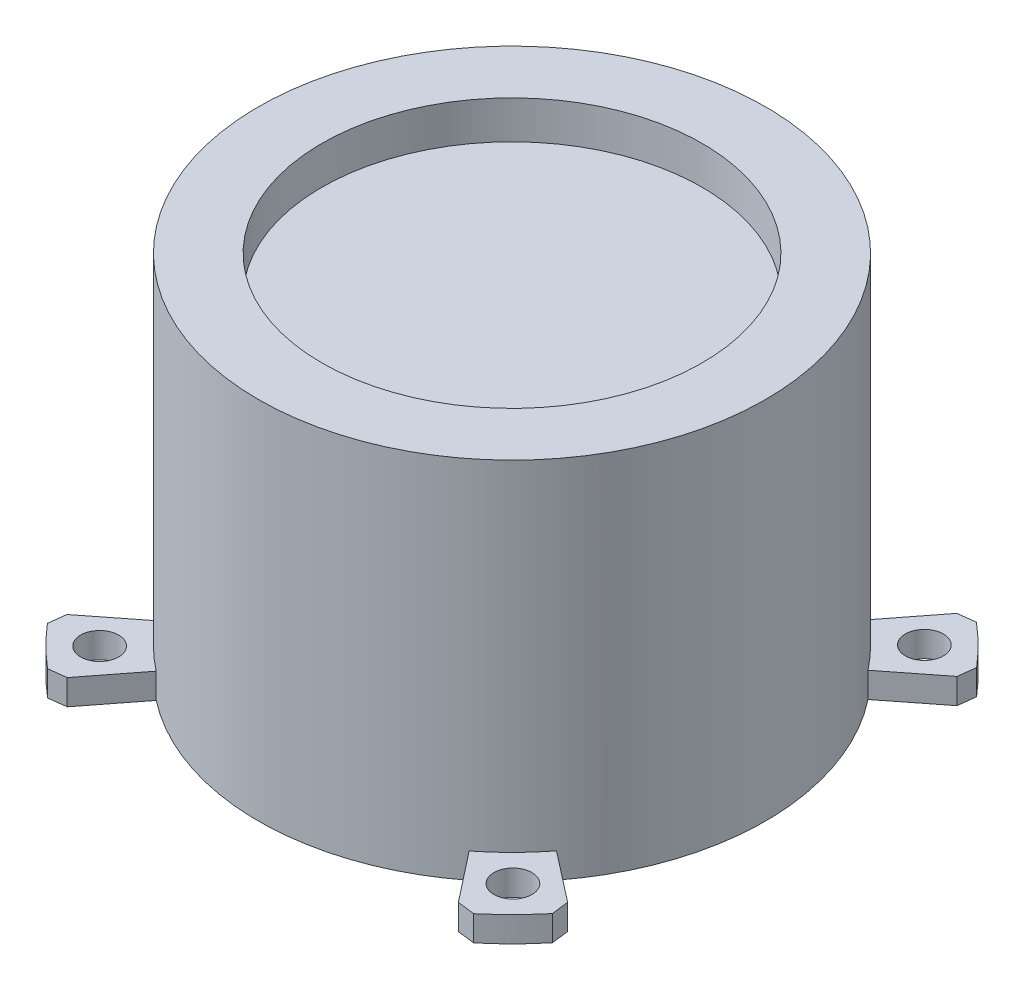
ISO-10303-21;
HEADER;
FILE_DESCRIPTION(('STEP AP214'),'2;1');
FILE_NAME('part.step','',(''),(''),'','','');
FILE_SCHEMA(('AUTOMOTIVE_DESIGN { 1 0 10303 214 1 1 1 1 }'));
ENDSEC;
DATA;
#1=APPLICATION_CONTEXT('core data for automotive mechanical design processes');
#2=APPLICATION_PROTOCOL_DEFINITION('international standard','automotive_design',2000,#1);
#3=PRODUCT_CONTEXT('',#1,'mechanical');
#4=PRODUCT('Part','Part','',(#3));
#5=PRODUCT_RELATED_PRODUCT_CATEGORY('part','',(#4));
#6=PRODUCT_DEFINITION_FORMATION('','',#4);
#7=PRODUCT_DEFINITION_CONTEXT('part definition',#1,'design');
#8=PRODUCT_DEFINITION('design','',#6,#7);
#9=PRODUCT_DEFINITION_SHAPE('','',#8);
#10=(LENGTH_UNIT() NAMED_UNIT(*) SI_UNIT(.MILLI.,.METRE.));
#11=(NAMED_UNIT(*) PLANE_ANGLE_UNIT() SI_UNIT($,.RADIAN.));
#12=(NAMED_UNIT(*) SI_UNIT($,.STERADIAN.) SOLID_ANGLE_UNIT());
#13=UNCERTAINTY_MEASURE_WITH_UNIT(LENGTH_MEASURE(1.E-05),#10,'distance_accuracy_value','');
#14=(GEOMETRIC_REPRESENTATION_CONTEXT(3) GLOBAL_UNCERTAINTY_ASSIGNED_CONTEXT((#13)) GLOBAL_UNIT_ASSIGNED_CONTEXT((#10,
#11,#12)) REPRESENTATION_CONTEXT('',''));
#15=CARTESIAN_POINT('',(0.,0.,0.));
#16=DIRECTION('',(0.,0.,1.));
#17=DIRECTION('',(1.,0.,0.));
#18=AXIS2_PLACEMENT_3D('',#15,#16,#17);
#19=CARTESIAN_POINT('',(0.,25.8,0.));
#20=DIRECTION('',(0.,-1.,0.));
#21=DIRECTION('',(0.,0.,-1.));
#22=AXIS2_PLACEMENT_3D('',#19,#20,#21);
#23=CYLINDRICAL_SURFACE('',#22,20.);
#24=DIRECTION('',(0.,-1.,0.));
#25=VECTOR('',#24,1.);
#26=CARTESIAN_POINT('',(-15.7324645416802,2.,12.3486663022683));
#27=LINE('',#26,#25);
#28=CARTESIAN_POINT('',(-15.7324645416802,2.,12.3486663022683));
#29=VERTEX_POINT('',#28);
#30=CARTESIAN_POINT('',(-15.7324645416802,0.,12.3486663022683));
#31=VERTEX_POINT('',#30);
#32=EDGE_CURVE('E333',#29,#31,#27,.T.);
#33=ORIENTED_EDGE('',*,*,#32,.F.);
#34=CARTESIAN_POINT('',(0.,2.,0.));
#35=DIRECTION('',(0.,-1.,0.));
#36=DIRECTION('',(0.,0.,1.));
#37=AXIS2_PLACEMENT_3D('',#34,#35,#36);
#38=CIRCLE('',#37,20.);
#39=CARTESIAN_POINT('',(-12.2777303486084,2.,15.7878857826772));
#40=VERTEX_POINT('',#39);
#41=EDGE_CURVE('E327',#40,#29,#38,.T.);
#42=ORIENTED_EDGE('',*,*,#41,.F.);
#43=DIRECTION('',(0.,-1.,0.));
#44=VECTOR('',#43,1.);
#45=CARTESIAN_POINT('',(-12.2777303486084,2.,15.7878857826772));
#46=LINE('',#45,#44);
#47=CARTESIAN_POINT('',(-12.2777303486084,0.,15.7878857826772));
#48=VERTEX_POINT('',#47);
#49=EDGE_CURVE('E343',#40,#48,#46,.T.);
#50=ORIENTED_EDGE('',*,*,#49,.T.);
#51=CARTESIAN_POINT('',(0.,0.,0.));
#52=DIRECTION('',(0.,1.,0.));
#53=DIRECTION('',(0.,0.,1.));
#54=AXIS2_PLACEMENT_3D('',#51,#52,#53);
#55=CIRCLE('',#54,20.);
#56=CARTESIAN_POINT('',(12.3486663022684,0.,15.7324645416801));
#57=VERTEX_POINT('',#56);
#58=EDGE_CURVE('E248',#48,#57,#55,.T.);
#59=ORIENTED_EDGE('',*,*,#58,.T.);
#60=DIRECTION('',(0.,-1.,0.));
#61=VECTOR('',#60,1.);
#62=CARTESIAN_POINT('',(12.3486663022684,2.,15.7324645416801));
#63=LINE('',#62,#61);
#64=CARTESIAN_POINT('',(12.3486663022684,2.,15.7324645416801));
#65=VERTEX_POINT('',#64);
#66=EDGE_CURVE('E371',#65,#57,#63,.T.);
#67=ORIENTED_EDGE('',*,*,#66,.F.);
#68=CARTESIAN_POINT('',(0.,2.,0.));
#69=DIRECTION('',(0.,-1.,0.));
#70=DIRECTION('',(0.,0.,1.));
#71=AXIS2_PLACEMENT_3D('',#68,#69,#70);
#72=CIRCLE('',#71,20.);
#73=CARTESIAN_POINT('',(15.7878857826772,2.,12.2777303486084));
#74=VERTEX_POINT('',#73);
#75=EDGE_CURVE('E362',#74,#65,#72,.T.);
#76=ORIENTED_EDGE('',*,*,#75,.F.);
#77=DIRECTION('',(0.,-1.,0.));
#78=VECTOR('',#77,1.);
#79=CARTESIAN_POINT('',(15.7878857826772,2.,12.2777303486084));
#80=LINE('',#79,#78);
#81=CARTESIAN_POINT('',(15.7878857826772,0.,12.2777303486084));
#82=VERTEX_POINT('',#81);
#83=EDGE_CURVE('E242',#74,#82,#80,.T.);
#84=ORIENTED_EDGE('',*,*,#83,.T.);
#85=CARTESIAN_POINT('',(15.7324645416801,0.,-12.3486663022684));
#86=VERTEX_POINT('',#85);
#87=EDGE_CURVE('E235',#82,#86,#55,.T.);
#88=ORIENTED_EDGE('',*,*,#87,.T.);
#89=DIRECTION('',(0.,-1.,0.));
#90=VECTOR('',#89,1.);
#91=CARTESIAN_POINT('',(15.7324645416801,2.,-12.3486663022684));
#92=LINE('',#91,#90);
#93=CARTESIAN_POINT('',(15.7324645416801,2.,-12.3486663022684));
#94=VERTEX_POINT('',#93);
#95=EDGE_CURVE('E214',#94,#86,#92,.T.);
#96=ORIENTED_EDGE('',*,*,#95,.F.);
#97=CARTESIAN_POINT('',(0.,2.,0.));
#98=DIRECTION('',(0.,-1.,0.));
#99=DIRECTION('',(0.,0.,1.));
#100=AXIS2_PLACEMENT_3D('',#97,#98,#99);
#101=CIRCLE('',#100,20.);
#102=CARTESIAN_POINT('',(12.2777303486083,2.,-15.7878857826773));
#103=VERTEX_POINT('',#102);
#104=EDGE_CURVE('E400',#103,#94,#101,.T.);
#105=ORIENTED_EDGE('',*,*,#104,.F.);
#106=DIRECTION('',(0.,-1.,0.));
#107=VECTOR('',#106,1.);
#108=CARTESIAN_POINT('',(12.2777303486083,2.,-15.7878857826773));
#109=LINE('',#108,#107);
#110=CARTESIAN_POINT('',(12.2777303486083,0.,-15.7878857826773));
#111=VERTEX_POINT('',#110);
#112=EDGE_CURVE('E222',#103,#111,#109,.T.);
#113=ORIENTED_EDGE('',*,*,#112,.T.);
#114=CARTESIAN_POINT('',(-12.3486663022685,0.,-15.73246454168));
#115=VERTEX_POINT('',#114);
#116=EDGE_CURVE('E250',#111,#115,#55,.T.);
#117=ORIENTED_EDGE('',*,*,#116,.T.);
#118=DIRECTION('',(0.,-1.,0.));
#119=VECTOR('',#118,1.);
#120=CARTESIAN_POINT('',(-12.3486663022685,2.,-15.73246454168));
#121=LINE('',#120,#119);
#122=CARTESIAN_POINT('',(-12.3486663022685,2.,-15.73246454168));
#123=VERTEX_POINT('',#122);
#124=EDGE_CURVE('E268',#123,#115,#121,.T.);
#125=ORIENTED_EDGE('',*,*,#124,.F.);
#126=CARTESIAN_POINT('',(0.,2.,0.));
#127=DIRECTION('',(0.,-1.,0.));
#128=DIRECTION('',(0.,0.,1.));
#129=AXIS2_PLACEMENT_3D('',#126,#127,#128);
#130=CIRCLE('',#129,20.);
#131=CARTESIAN_POINT('',(-15.7878857826773,2.,-12.2777303486082));
#132=VERTEX_POINT('',#131);
#133=EDGE_CURVE('E292',#132,#123,#130,.T.);
#134=ORIENTED_EDGE('',*,*,#133,.F.);
#135=DIRECTION('',(0.,-1.,0.));
#136=VECTOR('',#135,1.);
#137=CARTESIAN_POINT('',(-15.7878857826773,2.,-12.2777303486082));
#138=LINE('',#137,#136);
#139=CARTESIAN_POINT('',(-15.7878857826773,0.,-12.2777303486082));
#140=VERTEX_POINT('',#139);
#141=EDGE_CURVE('E258',#132,#140,#138,.T.);
#142=ORIENTED_EDGE('',*,*,#141,.T.);
#143=EDGE_CURVE('E257',#140,#31,#55,.T.);
#144=ORIENTED_EDGE('',*,*,#143,.T.);
#145=EDGE_LOOP('',(#33,#42,#50,#59,#67,#76,#84,#88,#96,#105,#113,#117,#125,#134,#142,#144));
#146=FACE_BOUND('',#145,.T.);
#147=CARTESIAN_POINT('',(0.,28.8,0.));
#148=DIRECTION('',(0.,1.,0.));
#149=DIRECTION('',(0.,0.,1.));
#150=AXIS2_PLACEMENT_3D('',#147,#148,#149);
#151=CIRCLE('',#150,20.);
#152=CARTESIAN_POINT('',(0.,28.8,20.));
#153=VERTEX_POINT('',#152);
#154=EDGE_CURVE('E349',#153,#153,#151,.T.);
#155=ORIENTED_EDGE('',*,*,#154,.F.);
#156=EDGE_LOOP('',(#155));
#157=FACE_BOUND('',#156,.T.);
#158=ADVANCED_FACE('F50',(#146,#157),#23,.T.);
#159=CARTESIAN_POINT('',(0.,0.,0.));
#160=DIRECTION('',(0.,1.,0.));
#161=DIRECTION('',(0.,0.,1.));
#162=AXIS2_PLACEMENT_3D('',#159,#160,#161);
#163=PLANE('',#162);
#164=DIRECTION('',(-0.613886517430415,0.,0.789394289133863));
#165=VECTOR('',#164,1.);
#166=CARTESIAN_POINT('',(12.2777303486083,0.,-15.7878857826773));
#167=LINE('',#166,#165);
#168=CARTESIAN_POINT('',(15.3471629357604,0.,-19.7348572283466));
#169=VERTEX_POINT('',#168);
#170=EDGE_CURVE('E236',#169,#111,#167,.T.);
#171=ORIENTED_EDGE('',*,*,#170,.F.);
#172=DIRECTION('',(-0.992269374230529,0.,0.124102735522451));
#173=VECTOR('',#172,1.);
#174=CARTESIAN_POINT('',(15.3471629357604,0.,-19.7348572283466));
#175=LINE('',#174,#173);
#176=CARTESIAN_POINT('',(16.7244392127176,0.,-19.9071126238868));
#177=VERTEX_POINT('',#176);
#178=EDGE_CURVE('E571',#169,#177,#175,.F.);
#179=ORIENTED_EDGE('',*,*,#178,.T.);
#180=CARTESIAN_POINT('',(0.,0.,0.));
#181=DIRECTION('',(0.,1.,0.));
#182=DIRECTION('',(0.,0.,1.));
#183=AXIS2_PLACEMENT_3D('',#180,#181,#182);
#184=CIRCLE('',#183,26.);
#185=CARTESIAN_POINT('',(19.8316352906653,0.,-16.8138705150848));
#186=VERTEX_POINT('',#185);
#187=EDGE_CURVE('E390',#186,#177,#184,.T.);
#188=ORIENTED_EDGE('',*,*,#187,.F.);
#189=DIRECTION('',(0.119635334062753,0.,-0.992817902157135));
#190=VECTOR('',#189,1.);
#191=CARTESIAN_POINT('',(19.8316352906653,0.,-16.8138705150848));
#192=LINE('',#191,#190);
#193=CARTESIAN_POINT('',(19.6655806771001,0.,-15.4358328778355));
#194=VERTEX_POINT('',#193);
#195=EDGE_CURVE('E234',#186,#194,#192,.F.);
#196=ORIENTED_EDGE('',*,*,#195,.T.);
#197=DIRECTION('',(0.786623227084003,0.,-0.61743331511342));
#198=VECTOR('',#197,1.);
#199=CARTESIAN_POINT('',(15.7324645416801,0.,-12.3486663022684));
#200=LINE('',#199,#198);
#201=EDGE_CURVE('E217',#86,#194,#200,.T.);
#202=ORIENTED_EDGE('',*,*,#201,.F.);
#203=ORIENTED_EDGE('',*,*,#87,.F.);
#204=DIRECTION('',(-0.789394289133861,0.,-0.613886517430417));
#205=VECTOR('',#204,1.);
#206=CARTESIAN_POINT('',(15.7878857826772,0.,12.2777303486084));
#207=LINE('',#206,#205);
#208=CARTESIAN_POINT('',(19.7348572283465,0.,15.3471629357605));
#209=VERTEX_POINT('',#208);
#210=EDGE_CURVE('E372',#209,#82,#207,.T.);
#211=ORIENTED_EDGE('',*,*,#210,.F.);
#212=DIRECTION('',(-0.124102735522439,0.,-0.99226937423053));
#213=VECTOR('',#212,1.);
#214=CARTESIAN_POINT('',(19.7348572283465,0.,15.3471629357605));
#215=LINE('',#214,#213);
#216=CARTESIAN_POINT('',(19.9071126238868,0.,16.7244392127177));
#217=VERTEX_POINT('',#216);
#218=EDGE_CURVE('E589',#209,#217,#215,.F.);
#219=ORIENTED_EDGE('',*,*,#218,.T.);
#220=CARTESIAN_POINT('',(0.,0.,0.));
#221=DIRECTION('',(0.,1.,0.));
#222=DIRECTION('',(0.,0.,1.));
#223=AXIS2_PLACEMENT_3D('',#220,#221,#222);
#224=CIRCLE('',#223,26.);
#225=CARTESIAN_POINT('',(16.8138705150847,0.,19.8316352906654));
#226=VERTEX_POINT('',#225);
#227=EDGE_CURVE('E352',#226,#217,#224,.T.);
#228=ORIENTED_EDGE('',*,*,#227,.F.);
#229=DIRECTION('',(0.992817902157134,0.,0.119635334062759));
#230=VECTOR('',#229,1.);
#231=CARTESIAN_POINT('',(16.8138705150847,0.,19.8316352906654));
#232=LINE('',#231,#230);
#233=CARTESIAN_POINT('',(15.4358328778354,0.,19.6655806771001));
#234=VERTEX_POINT('',#233);
#235=EDGE_CURVE('E254',#226,#234,#232,.F.);
#236=ORIENTED_EDGE('',*,*,#235,.T.);
#237=DIRECTION('',(0.617433315113418,0.,0.786623227084005));
#238=VECTOR('',#237,1.);
#239=CARTESIAN_POINT('',(12.3486663022684,0.,15.7324645416801));
#240=LINE('',#239,#238);
#241=EDGE_CURVE('E363',#57,#234,#240,.T.);
#242=ORIENTED_EDGE('',*,*,#241,.F.);
#243=ORIENTED_EDGE('',*,*,#58,.F.);
#244=DIRECTION('',(0.61388651743042,0.,-0.789394289133859));
#245=VECTOR('',#244,1.);
#246=CARTESIAN_POINT('',(-12.2777303486084,0.,15.7878857826772));
#247=LINE('',#246,#245);
#248=CARTESIAN_POINT('',(-15.3471629357605,0.,19.7348572283465));
#249=VERTEX_POINT('',#248);
#250=EDGE_CURVE('E340',#249,#48,#247,.T.);
#251=ORIENTED_EDGE('',*,*,#250,.F.);
#252=DIRECTION('',(0.99226937423053,0.,-0.124102735522439));
#253=VECTOR('',#252,1.);
#254=CARTESIAN_POINT('',(-15.3471629357605,0.,19.7348572283465));
#255=LINE('',#254,#253);
#256=CARTESIAN_POINT('',(-16.7244392127177,0.,19.9071126238867));
#257=VERTEX_POINT('',#256);
#258=EDGE_CURVE('E583',#249,#257,#255,.F.);
#259=ORIENTED_EDGE('',*,*,#258,.T.);
#260=CARTESIAN_POINT('',(0.,0.,0.));
#261=DIRECTION('',(0.,1.,0.));
#262=DIRECTION('',(0.,0.,1.));
#263=AXIS2_PLACEMENT_3D('',#260,#261,#262);
#264=CIRCLE('',#263,26.);
#265=CARTESIAN_POINT('',(-19.8316352906654,0.,16.8138705150846));
#266=VERTEX_POINT('',#265);
#267=EDGE_CURVE('E313',#266,#257,#264,.T.);
#268=ORIENTED_EDGE('',*,*,#267,.F.);
#269=DIRECTION('',(-0.119635334062764,0.,0.992817902157133));
#270=VECTOR('',#269,1.);
#271=CARTESIAN_POINT('',(-19.8316352906654,0.,16.8138705150846));
#272=LINE('',#271,#270);
#273=CARTESIAN_POINT('',(-19.6655806771002,0.,15.4358328778354));
#274=VERTEX_POINT('',#273);
#275=EDGE_CURVE('E585',#266,#274,#272,.F.);
#276=ORIENTED_EDGE('',*,*,#275,.T.);
#277=DIRECTION('',(-0.786623227084008,0.,0.617433315113415));
#278=VECTOR('',#277,1.);
#279=CARTESIAN_POINT('',(-15.7324645416802,0.,12.3486663022683));
#280=LINE('',#279,#278);
#281=EDGE_CURVE('E325',#31,#274,#280,.T.);
#282=ORIENTED_EDGE('',*,*,#281,.F.);
#283=ORIENTED_EDGE('',*,*,#143,.F.);
#284=DIRECTION('',(0.789394289133865,0.,0.613886517430412));
#285=VECTOR('',#284,1.);
#286=CARTESIAN_POINT('',(-15.7878857826773,0.,-12.2777303486082));
#287=LINE('',#286,#285);
#288=CARTESIAN_POINT('',(-19.7348572283466,0.,-15.3471629357603));
#289=VERTEX_POINT('',#288);
#290=EDGE_CURVE('E282',#289,#140,#287,.T.);
#291=ORIENTED_EDGE('',*,*,#290,.F.);
#292=DIRECTION('',(0.124102735522446,0.,0.992269374230529));
#293=VECTOR('',#292,1.);
#294=CARTESIAN_POINT('',(-19.7348572283466,0.,-15.3471629357603));
#295=LINE('',#294,#293);
#296=CARTESIAN_POINT('',(-19.9071126238869,0.,-16.7244392127175));
#297=VERTEX_POINT('',#296);
#298=EDGE_CURVE('E576',#289,#297,#295,.F.);
#299=ORIENTED_EDGE('',*,*,#298,.T.);
#300=CARTESIAN_POINT('',(0.,0.,0.));
#301=DIRECTION('',(0.,1.,0.));
#302=DIRECTION('',(0.,0.,1.));
#303=AXIS2_PLACEMENT_3D('',#300,#301,#302);
#304=CIRCLE('',#303,26.);
#305=CARTESIAN_POINT('',(-16.8138705150848,0.,-19.8316352906653));
#306=VERTEX_POINT('',#305);
#307=EDGE_CURVE('E281',#306,#297,#304,.T.);
#308=ORIENTED_EDGE('',*,*,#307,.F.);
#309=DIRECTION('',(-0.992817902157135,0.,-0.119635334062752));
#310=VECTOR('',#309,1.);
#311=CARTESIAN_POINT('',(-16.8138705150848,0.,-19.8316352906653));
#312=LINE('',#311,#310);
#313=CARTESIAN_POINT('',(-15.4358328778356,0.,-19.6655806771));
#314=VERTEX_POINT('',#313);
#315=EDGE_CURVE('E577',#306,#314,#312,.F.);
#316=ORIENTED_EDGE('',*,*,#315,.T.);
#317=DIRECTION('',(-0.617433315113423,0.,-0.786623227084001));
#318=VECTOR('',#317,1.);
#319=CARTESIAN_POINT('',(-12.3486663022685,0.,-15.73246454168));
#320=LINE('',#319,#318);
#321=EDGE_CURVE('E277',#115,#314,#320,.T.);
#322=ORIENTED_EDGE('',*,*,#321,.F.);
#323=ORIENTED_EDGE('',*,*,#116,.F.);
#324=EDGE_LOOP('',(#171,#179,#188,#196,#202,#203,#211,#219,#228,#236,#242,#243,#251,#259,#268,
#276,#282,#283,#291,#299,#308,#316,#322,#323));
#325=FACE_BOUND('',#324,.T.);
#326=CARTESIAN_POINT('',(-16.3000152910676,0.,-16.226814274865));
#327=DIRECTION('',(0.,1.,0.));
#328=DIRECTION('',(0.,0.,1.));
#329=AXIS2_PLACEMENT_3D('',#326,#327,#328);
#330=CIRCLE('',#329,1.5);
#331=CARTESIAN_POINT('',(-16.3000152910676,0.,-14.726814274865));
#332=VERTEX_POINT('',#331);
#333=EDGE_CURVE('E301',#332,#332,#330,.T.);
#334=ORIENTED_EDGE('',*,*,#333,.T.);
#335=EDGE_LOOP('',(#334));
#336=FACE_BOUND('',#335,.T.);
#337=CARTESIAN_POINT('',(16.2268142748651,0.,-16.3000152910675));
#338=DIRECTION('',(0.,1.,0.));
#339=DIRECTION('',(0.,0.,1.));
#340=AXIS2_PLACEMENT_3D('',#337,#338,#339);
#341=CIRCLE('',#340,1.5);
#342=CARTESIAN_POINT('',(16.2268142748651,0.,-14.8000152910675));
#343=VERTEX_POINT('',#342);
#344=EDGE_CURVE('E304',#343,#343,#341,.T.);
#345=ORIENTED_EDGE('',*,*,#344,.T.);
#346=EDGE_LOOP('',(#345));
#347=FACE_BOUND('',#346,.T.);
#348=CARTESIAN_POINT('',(16.3000152910674,0.,16.2268142748652));
#349=DIRECTION('',(0.,1.,0.));
#350=DIRECTION('',(0.,0.,1.));
#351=AXIS2_PLACEMENT_3D('',#348,#349,#350);
#352=CIRCLE('',#351,1.5);
#353=CARTESIAN_POINT('',(16.3000152910674,0.,17.7268142748652));
#354=VERTEX_POINT('',#353);
#355=EDGE_CURVE('E353',#354,#354,#352,.T.);
#356=ORIENTED_EDGE('',*,*,#355,.T.);
#357=EDGE_LOOP('',(#356));
#358=FACE_BOUND('',#357,.T.);
#359=CARTESIAN_POINT('',(-16.2268142748652,0.,16.3000152910674));
#360=DIRECTION('',(0.,1.,0.));
#361=DIRECTION('',(0.,0.,1.));
#362=AXIS2_PLACEMENT_3D('',#359,#360,#361);
#363=CIRCLE('',#362,1.5);
#364=CARTESIAN_POINT('',(-16.2268142748652,0.,17.8000152910674));
#365=VERTEX_POINT('',#364);
#366=EDGE_CURVE('E312',#365,#365,#363,.T.);
#367=ORIENTED_EDGE('',*,*,#366,.T.);
#368=EDGE_LOOP('',(#367));
#369=FACE_BOUND('',#368,.T.);
#370=ADVANCED_FACE('F230',(#325,#336,#347,#358,#369),#163,.F.);
#371=CARTESIAN_POINT('',(0.,2.,0.));
#372=DIRECTION('',(0.,1.,0.));
#373=DIRECTION('',(0.,0.,1.));
#374=AXIS2_PLACEMENT_3D('',#371,#372,#373);
#375=PLANE('',#374);
#376=DIRECTION('',(-0.617433315113423,0.,-0.786623227084001));
#377=VECTOR('',#376,1.);
#378=CARTESIAN_POINT('',(-12.3486663022685,2.,-15.73246454168));
#379=LINE('',#378,#377);
#380=CARTESIAN_POINT('',(-15.4358328778356,2.,-19.6655806771));
#381=VERTEX_POINT('',#380);
#382=EDGE_CURVE('E271',#123,#381,#379,.T.);
#383=ORIENTED_EDGE('',*,*,#382,.T.);
#384=DIRECTION('',(0.992817902157135,0.,0.119635334062752));
#385=VECTOR('',#384,1.);
#386=CARTESIAN_POINT('',(2.11487389963225,2.,-17.5507067774678));
#387=LINE('',#386,#385);
#388=CARTESIAN_POINT('',(-16.8138705150848,2.,-19.8316352906653));
#389=VERTEX_POINT('',#388);
#390=EDGE_CURVE('E536',#381,#389,#387,.F.);
#391=ORIENTED_EDGE('',*,*,#390,.T.);
#392=CARTESIAN_POINT('',(0.,2.,0.));
#393=DIRECTION('',(0.,1.,0.));
#394=DIRECTION('',(0.,0.,1.));
#395=AXIS2_PLACEMENT_3D('',#392,#393,#394);
#396=CIRCLE('',#395,26.);
#397=CARTESIAN_POINT('',(-19.9071126238869,2.,-16.7244392127175));
#398=VERTEX_POINT('',#397);
#399=EDGE_CURVE('E278',#389,#398,#396,.T.);
#400=ORIENTED_EDGE('',*,*,#399,.T.);
#401=DIRECTION('',(-0.124102735522446,0.,-0.992269374230529));
#402=VECTOR('',#401,1.);
#403=CARTESIAN_POINT('',(-17.5410100820536,2.,2.19384714629307));
#404=LINE('',#403,#402);
#405=CARTESIAN_POINT('',(-19.7348572283466,2.,-15.3471629357603));
#406=VERTEX_POINT('',#405);
#407=EDGE_CURVE('E545',#398,#406,#404,.F.);
#408=ORIENTED_EDGE('',*,*,#407,.T.);
#409=DIRECTION('',(0.789394289133865,0.,0.613886517430412));
#410=VECTOR('',#409,1.);
#411=CARTESIAN_POINT('',(-15.7878857826773,2.,-12.2777303486082));
#412=LINE('',#411,#410);
#413=EDGE_CURVE('E294',#406,#132,#412,.T.);
#414=ORIENTED_EDGE('',*,*,#413,.T.);
#415=ORIENTED_EDGE('',*,*,#133,.T.);
#416=EDGE_LOOP('',(#383,#391,#400,#408,#414,#415));
#417=FACE_BOUND('',#416,.T.);
#418=CARTESIAN_POINT('',(-16.3000152910676,2.,-16.226814274865));
#419=DIRECTION('',(0.,1.,0.));
#420=DIRECTION('',(0.,0.,1.));
#421=AXIS2_PLACEMENT_3D('',#418,#419,#420);
#422=CIRCLE('',#421,1.5);
#423=CARTESIAN_POINT('',(-16.3000152910676,2.,-14.726814274865));
#424=VERTEX_POINT('',#423);
#425=EDGE_CURVE('E288',#424,#424,#422,.T.);
#426=ORIENTED_EDGE('',*,*,#425,.F.);
#427=EDGE_LOOP('',(#426));
#428=FACE_BOUND('',#427,.T.);
#429=ADVANCED_FACE('F442',(#417,#428),#375,.T.);
#430=CARTESIAN_POINT('',(0.,2.,0.));
#431=DIRECTION('',(0.,-1.,0.));
#432=DIRECTION('',(0.,0.,-1.));
#433=AXIS2_PLACEMENT_3D('',#430,#431,#432);
#434=CYLINDRICAL_SURFACE('',#433,26.);
#435=ORIENTED_EDGE('',*,*,#399,.F.);
#436=DIRECTION('',(0.,-1.,0.));
#437=VECTOR('',#436,1.);
#438=CARTESIAN_POINT('',(-16.8138705150848,2.,-19.8316352906653));
#439=LINE('',#438,#437);
#440=EDGE_CURVE('E548',#389,#306,#439,.T.);
#441=ORIENTED_EDGE('',*,*,#440,.T.);
#442=ORIENTED_EDGE('',*,*,#307,.T.);
#443=DIRECTION('',(0.,-1.,0.));
#444=VECTOR('',#443,1.);
#445=CARTESIAN_POINT('',(-19.9071126238869,2.,-16.7244392127175));
#446=LINE('',#445,#444);
#447=EDGE_CURVE('E552',#297,#398,#446,.F.);
#448=ORIENTED_EDGE('',*,*,#447,.T.);
#449=EDGE_LOOP('',(#435,#441,#442,#448));
#450=FACE_BOUND('',#449,.T.);
#451=ADVANCED_FACE('F650',(#450),#434,.T.);
#452=CARTESIAN_POINT('',(-15.7878857826773,2.,-12.2777303486082));
#453=DIRECTION('',(0.613886517430412,0.,-0.789394289133865));
#454=DIRECTION('',(-0.789394289133865,0.,-0.613886517430412));
#455=AXIS2_PLACEMENT_3D('',#452,#453,#454);
#456=PLANE('',#455);
#457=ORIENTED_EDGE('',*,*,#413,.F.);
#458=DIRECTION('',(0.,-1.,0.));
#459=VECTOR('',#458,1.);
#460=CARTESIAN_POINT('',(-19.7348572283466,2.,-15.3471629357603));
#461=LINE('',#460,#459);
#462=EDGE_CURVE('E533',#406,#289,#461,.T.);
#463=ORIENTED_EDGE('',*,*,#462,.T.);
#464=ORIENTED_EDGE('',*,*,#290,.T.);
#465=ORIENTED_EDGE('',*,*,#141,.F.);
#466=EDGE_LOOP('',(#457,#463,#464,#465));
#467=FACE_BOUND('',#466,.T.);
#468=ADVANCED_FACE('F652',(#467),#456,.F.);
#469=CARTESIAN_POINT('',(-12.3486663022685,2.,-15.73246454168));
#470=DIRECTION('',(-0.786623227084001,0.,0.617433315113423));
#471=DIRECTION('',(0.617433315113423,0.,0.786623227084001));
#472=AXIS2_PLACEMENT_3D('',#469,#470,#471);
#473=PLANE('',#472);
#474=ORIENTED_EDGE('',*,*,#321,.T.);
#475=DIRECTION('',(0.,1.,0.));
#476=VECTOR('',#475,1.);
#477=CARTESIAN_POINT('',(-15.4358328778356,2.,-19.6655806771));
#478=LINE('',#477,#476);
#479=EDGE_CURVE('E543',#314,#381,#478,.T.);
#480=ORIENTED_EDGE('',*,*,#479,.T.);
#481=ORIENTED_EDGE('',*,*,#382,.F.);
#482=ORIENTED_EDGE('',*,*,#124,.T.);
#483=EDGE_LOOP('',(#474,#480,#481,#482));
#484=FACE_BOUND('',#483,.T.);
#485=ADVANCED_FACE('F644',(#484),#473,.F.);
#486=CARTESIAN_POINT('',(-16.3000152910676,2.,-16.226814274865));
#487=DIRECTION('',(0.,-1.,0.));
#488=DIRECTION('',(0.,0.,-1.));
#489=AXIS2_PLACEMENT_3D('',#486,#487,#488);
#490=CYLINDRICAL_SURFACE('',#489,1.5);
#491=ORIENTED_EDGE('',*,*,#425,.T.);
#492=EDGE_LOOP('',(#491));
#493=FACE_BOUND('',#492,.T.);
#494=ORIENTED_EDGE('',*,*,#333,.F.);
#495=EDGE_LOOP('',(#494));
#496=FACE_BOUND('',#495,.T.);
#497=ADVANCED_FACE('F638',(#493,#496),#490,.F.);
#498=CARTESIAN_POINT('',(0.,2.,0.));
#499=DIRECTION('',(0.,1.,0.));
#500=DIRECTION('',(0.,0.,1.));
#501=AXIS2_PLACEMENT_3D('',#498,#499,#500);
#502=PLANE('',#501);
#503=CARTESIAN_POINT('',(0.,2.,0.));
#504=DIRECTION('',(0.,1.,0.));
#505=DIRECTION('',(0.,0.,1.));
#506=AXIS2_PLACEMENT_3D('',#503,#504,#505);
#507=CIRCLE('',#506,26.);
#508=CARTESIAN_POINT('',(19.8316352906653,2.,-16.8138705150848));
#509=VERTEX_POINT('',#508);
#510=CARTESIAN_POINT('',(16.7244392127176,2.,-19.9071126238868));
#511=VERTEX_POINT('',#510);
#512=EDGE_CURVE('E240',#509,#511,#507,.T.);
#513=ORIENTED_EDGE('',*,*,#512,.T.);
#514=DIRECTION('',(0.992269374230529,0.,-0.124102735522451));
#515=VECTOR('',#514,1.);
#516=CARTESIAN_POINT('',(-2.19384714629314,2.,-17.5410100820534));
#517=LINE('',#516,#515);
#518=CARTESIAN_POINT('',(15.3471629357604,2.,-19.7348572283466));
#519=VERTEX_POINT('',#518);
#520=EDGE_CURVE('E556',#511,#519,#517,.F.);
#521=ORIENTED_EDGE('',*,*,#520,.T.);
#522=DIRECTION('',(-0.613886517430415,0.,0.789394289133863));
#523=VECTOR('',#522,1.);
#524=CARTESIAN_POINT('',(12.2777303486083,2.,-15.7878857826773));
#525=LINE('',#524,#523);
#526=EDGE_CURVE('E391',#519,#103,#525,.T.);
#527=ORIENTED_EDGE('',*,*,#526,.T.);
#528=ORIENTED_EDGE('',*,*,#104,.T.);
#529=DIRECTION('',(0.786623227084003,0.,-0.61743331511342));
#530=VECTOR('',#529,1.);
#531=CARTESIAN_POINT('',(15.7324645416801,2.,-12.3486663022684));
#532=LINE('',#531,#530);
#533=CARTESIAN_POINT('',(19.6655806771001,2.,-15.4358328778355));
#534=VERTEX_POINT('',#533);
#535=EDGE_CURVE('E216',#94,#534,#532,.T.);
#536=ORIENTED_EDGE('',*,*,#535,.T.);
#537=DIRECTION('',(-0.119635334062753,0.,0.992817902157135));
#538=VECTOR('',#537,1.);
#539=CARTESIAN_POINT('',(17.5507067774678,2.,2.11487389963227));
#540=LINE('',#539,#538);
#541=EDGE_CURVE('E561',#534,#509,#540,.F.);
#542=ORIENTED_EDGE('',*,*,#541,.T.);
#543=EDGE_LOOP('',(#513,#521,#527,#528,#536,#542));
#544=FACE_BOUND('',#543,.T.);
#545=CARTESIAN_POINT('',(16.2268142748651,2.,-16.3000152910675));
#546=DIRECTION('',(0.,1.,0.));
#547=DIRECTION('',(0.,0.,1.));
#548=AXIS2_PLACEMENT_3D('',#545,#546,#547);
#549=CIRCLE('',#548,1.5);
#550=CARTESIAN_POINT('',(16.2268142748651,2.,-14.8000152910675));
#551=VERTEX_POINT('',#550);
#552=EDGE_CURVE('E384',#551,#551,#549,.T.);
#553=ORIENTED_EDGE('',*,*,#552,.F.);
#554=EDGE_LOOP('',(#553));
#555=FACE_BOUND('',#554,.T.);
#556=ADVANCED_FACE('F645',(#544,#555),#502,.T.);
#557=CARTESIAN_POINT('',(0.,2.,0.));
#558=DIRECTION('',(0.,-1.,0.));
#559=DIRECTION('',(0.,0.,-1.));
#560=AXIS2_PLACEMENT_3D('',#557,#558,#559);
#561=CYLINDRICAL_SURFACE('',#560,26.);
#562=ORIENTED_EDGE('',*,*,#187,.T.);
#563=DIRECTION('',(0.,-1.,0.));
#564=VECTOR('',#563,1.);
#565=CARTESIAN_POINT('',(16.7244392127176,2.,-19.9071126238868));
#566=LINE('',#565,#564);
#567=EDGE_CURVE('E562',#177,#511,#566,.F.);
#568=ORIENTED_EDGE('',*,*,#567,.T.);
#569=ORIENTED_EDGE('',*,*,#512,.F.);
#570=DIRECTION('',(0.,-1.,0.));
#571=VECTOR('',#570,1.);
#572=CARTESIAN_POINT('',(19.8316352906653,2.,-16.8138705150848));
#573=LINE('',#572,#571);
#574=EDGE_CURVE('E570',#509,#186,#573,.T.);
#575=ORIENTED_EDGE('',*,*,#574,.T.);
#576=EDGE_LOOP('',(#562,#568,#569,#575));
#577=FACE_BOUND('',#576,.T.);
#578=ADVANCED_FACE('F812',(#577),#561,.T.);
#579=CARTESIAN_POINT('',(12.2777303486083,2.,-15.7878857826773));
#580=DIRECTION('',(0.789394289133863,0.,0.613886517430415));
#581=DIRECTION('',(0.613886517430415,0.,-0.789394289133863));
#582=AXIS2_PLACEMENT_3D('',#579,#580,#581);
#583=PLANE('',#582);
#584=ORIENTED_EDGE('',*,*,#526,.F.);
#585=DIRECTION('',(0.,-1.,0.));
#586=VECTOR('',#585,1.);
#587=CARTESIAN_POINT('',(15.3471629357604,2.,-19.7348572283466));
#588=LINE('',#587,#586);
#589=EDGE_CURVE('E246',#519,#169,#588,.T.);
#590=ORIENTED_EDGE('',*,*,#589,.T.);
#591=ORIENTED_EDGE('',*,*,#170,.T.);
#592=ORIENTED_EDGE('',*,*,#112,.F.);
#593=EDGE_LOOP('',(#584,#590,#591,#592));
#594=FACE_BOUND('',#593,.T.);
#595=ADVANCED_FACE('F804',(#594),#583,.F.);
#596=CARTESIAN_POINT('',(15.7324645416801,2.,-12.3486663022684));
#597=DIRECTION('',(-0.617433315113421,0.,-0.786623227084004));
#598=DIRECTION('',(-0.786623227084003,0.,0.61743331511342));
#599=AXIS2_PLACEMENT_3D('',#596,#597,#598);
#600=PLANE('',#599);
#601=ORIENTED_EDGE('',*,*,#201,.T.);
#602=DIRECTION('',(0.,1.,0.));
#603=VECTOR('',#602,1.);
#604=CARTESIAN_POINT('',(19.6655806771001,2.,-15.4358328778355));
#605=LINE('',#604,#603);
#606=EDGE_CURVE('E554',#194,#534,#605,.T.);
#607=ORIENTED_EDGE('',*,*,#606,.T.);
#608=ORIENTED_EDGE('',*,*,#535,.F.);
#609=ORIENTED_EDGE('',*,*,#95,.T.);
#610=EDGE_LOOP('',(#601,#607,#608,#609));
#611=FACE_BOUND('',#610,.T.);
#612=ADVANCED_FACE('F213',(#611),#600,.F.);
#613=CARTESIAN_POINT('',(16.2268142748651,2.,-16.3000152910675));
#614=DIRECTION('',(0.,-1.,0.));
#615=DIRECTION('',(0.,0.,-1.));
#616=AXIS2_PLACEMENT_3D('',#613,#614,#615);
#617=CYLINDRICAL_SURFACE('',#616,1.5);
#618=ORIENTED_EDGE('',*,*,#552,.T.);
#619=EDGE_LOOP('',(#618));
#620=FACE_BOUND('',#619,.T.);
#621=ORIENTED_EDGE('',*,*,#344,.F.);
#622=EDGE_LOOP('',(#621));
#623=FACE_BOUND('',#622,.T.);
#624=ADVANCED_FACE('F606',(#620,#623),#617,.F.);
#625=CARTESIAN_POINT('',(0.,2.,0.));
#626=DIRECTION('',(0.,1.,0.));
#627=DIRECTION('',(0.,0.,1.));
#628=AXIS2_PLACEMENT_3D('',#625,#626,#627);
#629=PLANE('',#628);
#630=CARTESIAN_POINT('',(0.,2.,0.));
#631=DIRECTION('',(0.,1.,0.));
#632=DIRECTION('',(0.,0.,1.));
#633=AXIS2_PLACEMENT_3D('',#630,#631,#632);
#634=CIRCLE('',#633,26.);
#635=CARTESIAN_POINT('',(16.8138705150847,2.,19.8316352906654));
#636=VERTEX_POINT('',#635);
#637=CARTESIAN_POINT('',(19.9071126238868,2.,16.7244392127177));
#638=VERTEX_POINT('',#637);
#639=EDGE_CURVE('E356',#636,#638,#634,.T.);
#640=ORIENTED_EDGE('',*,*,#639,.T.);
#641=DIRECTION('',(0.124102735522439,0.,0.99226937423053));
#642=VECTOR('',#641,1.);
#643=CARTESIAN_POINT('',(17.5410100820536,2.,-2.19384714629295));
#644=LINE('',#643,#642);
#645=CARTESIAN_POINT('',(19.7348572283465,2.,15.3471629357605));
#646=VERTEX_POINT('',#645);
#647=EDGE_CURVE('E60',#638,#646,#644,.F.);
#648=ORIENTED_EDGE('',*,*,#647,.T.);
#649=DIRECTION('',(-0.789394289133861,0.,-0.613886517430417));
#650=VECTOR('',#649,1.);
#651=CARTESIAN_POINT('',(15.7878857826772,2.,12.2777303486084));
#652=LINE('',#651,#650);
#653=EDGE_CURVE('E365',#646,#74,#652,.T.);
#654=ORIENTED_EDGE('',*,*,#653,.T.);
#655=ORIENTED_EDGE('',*,*,#75,.T.);
#656=DIRECTION('',(0.617433315113418,0.,0.786623227084005));
#657=VECTOR('',#656,1.);
#658=CARTESIAN_POINT('',(12.3486663022684,2.,15.7324645416801));
#659=LINE('',#658,#657);
#660=CARTESIAN_POINT('',(15.4358328778354,2.,19.6655806771001));
#661=VERTEX_POINT('',#660);
#662=EDGE_CURVE('E368',#65,#661,#659,.T.);
#663=ORIENTED_EDGE('',*,*,#662,.T.);
#664=DIRECTION('',(-0.992817902157134,0.,-0.119635334062759));
#665=VECTOR('',#664,1.);
#666=CARTESIAN_POINT('',(-2.11487389963237,2.,17.5507067774678));
#667=LINE('',#666,#665);
#668=EDGE_CURVE('E503',#661,#636,#667,.F.);
#669=ORIENTED_EDGE('',*,*,#668,.T.);
#670=EDGE_LOOP('',(#640,#648,#654,#655,#663,#669));
#671=FACE_BOUND('',#670,.T.);
#672=CARTESIAN_POINT('',(16.3000152910674,2.,16.2268142748652));
#673=DIRECTION('',(0.,1.,0.));
#674=DIRECTION('',(0.,0.,1.));
#675=AXIS2_PLACEMENT_3D('',#672,#673,#674);
#676=CIRCLE('',#675,1.5);
#677=CARTESIAN_POINT('',(16.3000152910674,2.,17.7268142748652));
#678=VERTEX_POINT('',#677);
#679=EDGE_CURVE('E346',#678,#678,#676,.T.);
#680=ORIENTED_EDGE('',*,*,#679,.F.);
#681=EDGE_LOOP('',(#680));
#682=FACE_BOUND('',#681,.T.);
#683=ADVANCED_FACE('F600',(#671,#682),#629,.T.);
#684=CARTESIAN_POINT('',(0.,2.,0.));
#685=DIRECTION('',(0.,-1.,0.));
#686=DIRECTION('',(0.,0.,-1.));
#687=AXIS2_PLACEMENT_3D('',#684,#685,#686);
#688=CYLINDRICAL_SURFACE('',#687,26.);
#689=ORIENTED_EDGE('',*,*,#227,.T.);
#690=DIRECTION('',(0.,-1.,0.));
#691=VECTOR('',#690,1.);
#692=CARTESIAN_POINT('',(19.9071126238868,2.,16.7244392127176));
#693=LINE('',#692,#691);
#694=EDGE_CURVE('E68',#217,#638,#693,.F.);
#695=ORIENTED_EDGE('',*,*,#694,.T.);
#696=ORIENTED_EDGE('',*,*,#639,.F.);
#697=DIRECTION('',(0.,-1.,0.));
#698=VECTOR('',#697,1.);
#699=CARTESIAN_POINT('',(16.8138705150847,2.,19.8316352906654));
#700=LINE('',#699,#698);
#701=EDGE_CURVE('E508',#636,#226,#700,.T.);
#702=ORIENTED_EDGE('',*,*,#701,.T.);
#703=EDGE_LOOP('',(#689,#695,#696,#702));
#704=FACE_BOUND('',#703,.T.);
#705=ADVANCED_FACE('F599',(#704),#688,.T.);
#706=CARTESIAN_POINT('',(15.7878857826772,2.,12.2777303486084));
#707=DIRECTION('',(-0.613886517430417,0.,0.789394289133861));
#708=DIRECTION('',(0.789394289133861,0.,0.613886517430417));
#709=AXIS2_PLACEMENT_3D('',#706,#707,#708);
#710=PLANE('',#709);
#711=ORIENTED_EDGE('',*,*,#653,.F.);
#712=DIRECTION('',(0.,-1.,0.));
#713=VECTOR('',#712,1.);
#714=CARTESIAN_POINT('',(19.7348572283465,2.,15.3471629357605));
#715=LINE('',#714,#713);
#716=EDGE_CURVE('E497',#646,#209,#715,.T.);
#717=ORIENTED_EDGE('',*,*,#716,.T.);
#718=ORIENTED_EDGE('',*,*,#210,.T.);
#719=ORIENTED_EDGE('',*,*,#83,.F.);
#720=EDGE_LOOP('',(#711,#717,#718,#719));
#721=FACE_BOUND('',#720,.T.);
#722=ADVANCED_FACE('F602',(#721),#710,.F.);
#723=CARTESIAN_POINT('',(12.3486663022684,2.,15.7324645416801));
#724=DIRECTION('',(0.786623227084005,0.,-0.617433315113418));
#725=DIRECTION('',(-0.617433315113418,0.,-0.786623227084005));
#726=AXIS2_PLACEMENT_3D('',#723,#724,#725);
#727=PLANE('',#726);
#728=ORIENTED_EDGE('',*,*,#241,.T.);
#729=DIRECTION('',(0.,1.,0.));
#730=VECTOR('',#729,1.);
#731=CARTESIAN_POINT('',(15.4358328778354,2.,19.6655806771001));
#732=LINE('',#731,#730);
#733=EDGE_CURVE('E11',#234,#661,#732,.T.);
#734=ORIENTED_EDGE('',*,*,#733,.T.);
#735=ORIENTED_EDGE('',*,*,#662,.F.);
#736=ORIENTED_EDGE('',*,*,#66,.T.);
#737=EDGE_LOOP('',(#728,#734,#735,#736));
#738=FACE_BOUND('',#737,.T.);
#739=ADVANCED_FACE('F594',(#738),#727,.F.);
#740=CARTESIAN_POINT('',(16.3000152910674,2.,16.2268142748652));
#741=DIRECTION('',(0.,-1.,0.));
#742=DIRECTION('',(0.,0.,-1.));
#743=AXIS2_PLACEMENT_3D('',#740,#741,#742);
#744=CYLINDRICAL_SURFACE('',#743,1.5);
#745=ORIENTED_EDGE('',*,*,#679,.T.);
#746=EDGE_LOOP('',(#745));
#747=FACE_BOUND('',#746,.T.);
#748=ORIENTED_EDGE('',*,*,#355,.F.);
#749=EDGE_LOOP('',(#748));
#750=FACE_BOUND('',#749,.T.);
#751=ADVANCED_FACE('F614',(#747,#750),#744,.F.);
#752=CARTESIAN_POINT('',(0.,2.,0.));
#753=DIRECTION('',(0.,1.,0.));
#754=DIRECTION('',(0.,0.,1.));
#755=AXIS2_PLACEMENT_3D('',#752,#753,#754);
#756=PLANE('',#755);
#757=DIRECTION('',(-0.786623227084008,0.,0.617433315113415));
#758=VECTOR('',#757,1.);
#759=CARTESIAN_POINT('',(-15.7324645416802,2.,12.3486663022683));
#760=LINE('',#759,#758);
#761=CARTESIAN_POINT('',(-19.6655806771002,2.,15.4358328778354));
#762=VERTEX_POINT('',#761);
#763=EDGE_CURVE('E326',#29,#762,#760,.T.);
#764=ORIENTED_EDGE('',*,*,#763,.T.);
#765=DIRECTION('',(0.119635334062764,0.,-0.992817902157133));
#766=VECTOR('',#765,1.);
#767=CARTESIAN_POINT('',(-17.5507067774677,2.,-2.11487389963246));
#768=LINE('',#767,#766);
#769=CARTESIAN_POINT('',(-19.8316352906654,2.,16.8138705150846));
#770=VERTEX_POINT('',#769);
#771=EDGE_CURVE('E516',#762,#770,#768,.F.);
#772=ORIENTED_EDGE('',*,*,#771,.T.);
#773=CARTESIAN_POINT('',(0.,2.,0.));
#774=DIRECTION('',(0.,1.,0.));
#775=DIRECTION('',(0.,0.,1.));
#776=AXIS2_PLACEMENT_3D('',#773,#774,#775);
#777=CIRCLE('',#776,26.);
#778=CARTESIAN_POINT('',(-16.7244392127177,2.,19.9071126238867));
#779=VERTEX_POINT('',#778);
#780=EDGE_CURVE('E319',#770,#779,#777,.T.);
#781=ORIENTED_EDGE('',*,*,#780,.T.);
#782=DIRECTION('',(-0.99226937423053,0.,0.124102735522439));
#783=VECTOR('',#782,1.);
#784=CARTESIAN_POINT('',(2.19384714629293,2.,17.5410100820536));
#785=LINE('',#784,#783);
#786=CARTESIAN_POINT('',(-15.3471629357605,2.,19.7348572283465));
#787=VERTEX_POINT('',#786);
#788=EDGE_CURVE('E525',#779,#787,#785,.F.);
#789=ORIENTED_EDGE('',*,*,#788,.T.);
#790=DIRECTION('',(0.61388651743042,0.,-0.789394289133859));
#791=VECTOR('',#790,1.);
#792=CARTESIAN_POINT('',(-12.2777303486084,2.,15.7878857826772));
#793=LINE('',#792,#791);
#794=EDGE_CURVE('E324',#787,#40,#793,.T.);
#795=ORIENTED_EDGE('',*,*,#794,.T.);
#796=ORIENTED_EDGE('',*,*,#41,.T.);
#797=EDGE_LOOP('',(#764,#772,#781,#789,#795,#796));
#798=FACE_BOUND('',#797,.T.);
#799=CARTESIAN_POINT('',(-16.2268142748652,2.,16.3000152910674));
#800=DIRECTION('',(0.,1.,0.));
#801=DIRECTION('',(0.,0.,1.));
#802=AXIS2_PLACEMENT_3D('',#799,#800,#801);
#803=CIRCLE('',#802,1.5);
#804=CARTESIAN_POINT('',(-16.2268142748652,2.,17.8000152910674));
#805=VERTEX_POINT('',#804);
#806=EDGE_CURVE('E307',#805,#805,#803,.T.);
#807=ORIENTED_EDGE('',*,*,#806,.F.);
#808=EDGE_LOOP('',(#807));
#809=FACE_BOUND('',#808,.T.);
#810=ADVANCED_FACE('F620',(#798,#809),#756,.T.);
#811=CARTESIAN_POINT('',(0.,2.,0.));
#812=DIRECTION('',(0.,-1.,0.));
#813=DIRECTION('',(0.,0.,-1.));
#814=AXIS2_PLACEMENT_3D('',#811,#812,#813);
#815=CYLINDRICAL_SURFACE('',#814,26.);
#816=ORIENTED_EDGE('',*,*,#780,.F.);
#817=DIRECTION('',(0.,-1.,0.));
#818=VECTOR('',#817,1.);
#819=CARTESIAN_POINT('',(-19.8316352906654,2.,16.8138705150846));
#820=LINE('',#819,#818);
#821=EDGE_CURVE('E528',#770,#266,#820,.T.);
#822=ORIENTED_EDGE('',*,*,#821,.T.);
#823=ORIENTED_EDGE('',*,*,#267,.T.);
#824=DIRECTION('',(0.,-1.,0.));
#825=VECTOR('',#824,1.);
#826=CARTESIAN_POINT('',(-16.7244392127177,2.,19.9071126238867));
#827=LINE('',#826,#825);
#828=EDGE_CURVE('E535',#257,#779,#827,.F.);
#829=ORIENTED_EDGE('',*,*,#828,.T.);
#830=EDGE_LOOP('',(#816,#822,#823,#829));
#831=FACE_BOUND('',#830,.T.);
#832=ADVANCED_FACE('F623',(#831),#815,.T.);
#833=CARTESIAN_POINT('',(-12.2777303486084,2.,15.7878857826772));
#834=DIRECTION('',(-0.789394289133859,0.,-0.61388651743042));
#835=DIRECTION('',(-0.61388651743042,0.,0.789394289133859));
#836=AXIS2_PLACEMENT_3D('',#833,#834,#835);
#837=PLANE('',#836);
#838=ORIENTED_EDGE('',*,*,#794,.F.);
#839=DIRECTION('',(0.,-1.,0.));
#840=VECTOR('',#839,1.);
#841=CARTESIAN_POINT('',(-15.3471629357605,2.,19.7348572283465));
#842=LINE('',#841,#840);
#843=EDGE_CURVE('E513',#787,#249,#842,.T.);
#844=ORIENTED_EDGE('',*,*,#843,.T.);
#845=ORIENTED_EDGE('',*,*,#250,.T.);
#846=ORIENTED_EDGE('',*,*,#49,.F.);
#847=EDGE_LOOP('',(#838,#844,#845,#846));
#848=FACE_BOUND('',#847,.T.);
#849=ADVANCED_FACE('F624',(#848),#837,.F.);
#850=CARTESIAN_POINT('',(-15.7324645416802,2.,12.3486663022683));
#851=DIRECTION('',(0.617433315113415,0.,0.786623227084008));
#852=DIRECTION('',(0.786623227084008,0.,-0.617433315113415));
#853=AXIS2_PLACEMENT_3D('',#850,#851,#852);
#854=PLANE('',#853);
#855=ORIENTED_EDGE('',*,*,#281,.T.);
#856=DIRECTION('',(0.,1.,0.));
#857=VECTOR('',#856,1.);
#858=CARTESIAN_POINT('',(-19.6655806771002,2.,15.4358328778354));
#859=LINE('',#858,#857);
#860=EDGE_CURVE('E523',#274,#762,#859,.T.);
#861=ORIENTED_EDGE('',*,*,#860,.T.);
#862=ORIENTED_EDGE('',*,*,#763,.F.);
#863=ORIENTED_EDGE('',*,*,#32,.T.);
#864=EDGE_LOOP('',(#855,#861,#862,#863));
#865=FACE_BOUND('',#864,.T.);
#866=ADVANCED_FACE('F628',(#865),#854,.F.);
#867=CARTESIAN_POINT('',(-16.2268142748652,2.,16.3000152910674));
#868=DIRECTION('',(0.,-1.,0.));
#869=DIRECTION('',(0.,0.,-1.));
#870=AXIS2_PLACEMENT_3D('',#867,#868,#869);
#871=CYLINDRICAL_SURFACE('',#870,1.5);
#872=ORIENTED_EDGE('',*,*,#806,.T.);
#873=EDGE_LOOP('',(#872));
#874=FACE_BOUND('',#873,.T.);
#875=ORIENTED_EDGE('',*,*,#366,.F.);
#876=EDGE_LOOP('',(#875));
#877=FACE_BOUND('',#876,.T.);
#878=ADVANCED_FACE('F453',(#874,#877),#871,.F.);
#879=CARTESIAN_POINT('',(15.3471629357604,2.,-19.7348572283466));
#880=DIRECTION('',(0.124102735522451,0.,0.992269374230529));
#881=DIRECTION('',(0.,-1.,0.));
#882=AXIS2_PLACEMENT_3D('',#879,#880,#881);
#883=PLANE('',#882);
#884=ORIENTED_EDGE('',*,*,#520,.F.);
#885=ORIENTED_EDGE('',*,*,#567,.F.);
#886=ORIENTED_EDGE('',*,*,#178,.F.);
#887=ORIENTED_EDGE('',*,*,#589,.F.);
#888=EDGE_LOOP('',(#884,#885,#886,#887));
#889=FACE_BOUND('',#888,.T.);
#890=ADVANCED_FACE('F449',(#889),#883,.F.);
#891=CARTESIAN_POINT('',(19.8316352906653,2.,-16.8138705150848));
#892=DIRECTION('',(-0.992817902157135,0.,-0.119635334062753));
#893=DIRECTION('',(0.,-1.,0.));
#894=AXIS2_PLACEMENT_3D('',#891,#892,#893);
#895=PLANE('',#894);
#896=ORIENTED_EDGE('',*,*,#541,.F.);
#897=ORIENTED_EDGE('',*,*,#606,.F.);
#898=ORIENTED_EDGE('',*,*,#195,.F.);
#899=ORIENTED_EDGE('',*,*,#574,.F.);
#900=EDGE_LOOP('',(#896,#897,#898,#899));
#901=FACE_BOUND('',#900,.T.);
#902=ADVANCED_FACE('F451',(#901),#895,.F.);
#903=CARTESIAN_POINT('',(-16.8138705150848,2.,-19.8316352906653));
#904=DIRECTION('',(-0.119635334062752,0.,0.992817902157135));
#905=DIRECTION('',(0.,-1.,0.));
#906=AXIS2_PLACEMENT_3D('',#903,#904,#905);
#907=PLANE('',#906);
#908=ORIENTED_EDGE('',*,*,#390,.F.);
#909=ORIENTED_EDGE('',*,*,#479,.F.);
#910=ORIENTED_EDGE('',*,*,#315,.F.);
#911=ORIENTED_EDGE('',*,*,#440,.F.);
#912=EDGE_LOOP('',(#908,#909,#910,#911));
#913=FACE_BOUND('',#912,.T.);
#914=ADVANCED_FACE('F465',(#913),#907,.F.);
#915=CARTESIAN_POINT('',(-19.7348572283466,2.,-15.3471629357603));
#916=DIRECTION('',(0.992269374230529,0.,-0.124102735522446));
#917=DIRECTION('',(0.,-1.,0.));
#918=AXIS2_PLACEMENT_3D('',#915,#916,#917);
#919=PLANE('',#918);
#920=ORIENTED_EDGE('',*,*,#407,.F.);
#921=ORIENTED_EDGE('',*,*,#447,.F.);
#922=ORIENTED_EDGE('',*,*,#298,.F.);
#923=ORIENTED_EDGE('',*,*,#462,.F.);
#924=EDGE_LOOP('',(#920,#921,#922,#923));
#925=FACE_BOUND('',#924,.T.);
#926=ADVANCED_FACE('F469',(#925),#919,.F.);
#927=CARTESIAN_POINT('',(-19.8316352906654,2.,16.8138705150846));
#928=DIRECTION('',(0.992817902157133,0.,0.119635334062764));
#929=DIRECTION('',(0.,-1.,0.));
#930=AXIS2_PLACEMENT_3D('',#927,#928,#929);
#931=PLANE('',#930);
#932=ORIENTED_EDGE('',*,*,#771,.F.);
#933=ORIENTED_EDGE('',*,*,#860,.F.);
#934=ORIENTED_EDGE('',*,*,#275,.F.);
#935=ORIENTED_EDGE('',*,*,#821,.F.);
#936=EDGE_LOOP('',(#932,#933,#934,#935));
#937=FACE_BOUND('',#936,.T.);
#938=ADVANCED_FACE('F477',(#937),#931,.F.);
#939=CARTESIAN_POINT('',(-15.3471629357605,2.,19.7348572283465));
#940=DIRECTION('',(-0.124102735522439,0.,-0.99226937423053));
#941=DIRECTION('',(0.,-1.,0.));
#942=AXIS2_PLACEMENT_3D('',#939,#940,#941);
#943=PLANE('',#942);
#944=ORIENTED_EDGE('',*,*,#788,.F.);
#945=ORIENTED_EDGE('',*,*,#828,.F.);
#946=ORIENTED_EDGE('',*,*,#258,.F.);
#947=ORIENTED_EDGE('',*,*,#843,.F.);
#948=EDGE_LOOP('',(#944,#945,#946,#947));
#949=FACE_BOUND('',#948,.T.);
#950=ADVANCED_FACE('F483',(#949),#943,.F.);
#951=CARTESIAN_POINT('',(19.7348572283465,2.,15.3471629357605));
#952=DIRECTION('',(-0.99226937423053,0.,0.124102735522439));
#953=DIRECTION('',(0.,-1.,0.));
#954=AXIS2_PLACEMENT_3D('',#951,#952,#953);
#955=PLANE('',#954);
#956=ORIENTED_EDGE('',*,*,#647,.F.);
#957=ORIENTED_EDGE('',*,*,#694,.F.);
#958=ORIENTED_EDGE('',*,*,#218,.F.);
#959=ORIENTED_EDGE('',*,*,#716,.F.);
#960=EDGE_LOOP('',(#956,#957,#958,#959));
#961=FACE_BOUND('',#960,.T.);
#962=ADVANCED_FACE('F436',(#961),#955,.F.);
#963=CARTESIAN_POINT('',(16.8138705150847,2.,19.8316352906654));
#964=DIRECTION('',(0.119635334062759,0.,-0.992817902157134));
#965=DIRECTION('',(0.,-1.,0.));
#966=AXIS2_PLACEMENT_3D('',#963,#964,#965);
#967=PLANE('',#966);
#968=ORIENTED_EDGE('',*,*,#668,.F.);
#969=ORIENTED_EDGE('',*,*,#733,.F.);
#970=ORIENTED_EDGE('',*,*,#235,.F.);
#971=ORIENTED_EDGE('',*,*,#701,.F.);
#972=EDGE_LOOP('',(#968,#969,#970,#971));
#973=FACE_BOUND('',#972,.T.);
#974=ADVANCED_FACE('F49',(#973),#967,.F.);
#975=CARTESIAN_POINT('',(0.,28.8,0.));
#976=DIRECTION('',(0.,1.,0.));
#977=DIRECTION('',(0.,0.,1.));
#978=AXIS2_PLACEMENT_3D('',#975,#976,#977);
#979=PLANE('',#978);
#980=ORIENTED_EDGE('',*,*,#154,.T.);
#981=EDGE_LOOP('',(#980));
#982=FACE_BOUND('',#981,.T.);
#983=CARTESIAN_POINT('',(0.,28.8,0.));
#984=DIRECTION('',(0.,1.,0.));
#985=DIRECTION('',(0.,0.,1.));
#986=AXIS2_PLACEMENT_3D('',#983,#984,#985);
#987=CIRCLE('',#986,15.);
#988=CARTESIAN_POINT('',(0.,28.8,15.));
#989=VERTEX_POINT('',#988);
#990=EDGE_CURVE('E414',#989,#989,#987,.T.);
#991=ORIENTED_EDGE('',*,*,#990,.F.);
#992=EDGE_LOOP('',(#991));
#993=FACE_BOUND('',#992,.T.);
#994=ADVANCED_FACE('F424',(#982,#993),#979,.T.);
#995=CARTESIAN_POINT('',(0.,28.8,0.));
#996=DIRECTION('',(0.,-1.,0.));
#997=DIRECTION('',(0.,0.,-1.));
#998=AXIS2_PLACEMENT_3D('',#995,#996,#997);
#999=CYLINDRICAL_SURFACE('',#998,15.);
#1000=ORIENTED_EDGE('',*,*,#990,.T.);
#1001=EDGE_LOOP('',(#1000));
#1002=FACE_BOUND('',#1001,.T.);
#1003=CARTESIAN_POINT('',(0.,25.8,0.));
#1004=DIRECTION('',(0.,1.,0.));
#1005=DIRECTION('',(0.,0.,1.));
#1006=AXIS2_PLACEMENT_3D('',#1003,#1004,#1005);
#1007=CIRCLE('',#1006,15.);
#1008=CARTESIAN_POINT('',(0.,25.8,15.));
#1009=VERTEX_POINT('',#1008);
#1010=EDGE_CURVE('E411',#1009,#1009,#1007,.T.);
#1011=ORIENTED_EDGE('',*,*,#1010,.F.);
#1012=EDGE_LOOP('',(#1011));
#1013=FACE_BOUND('',#1012,.T.);
#1014=ADVANCED_FACE('F422',(#1002,#1013),#999,.F.);
#1015=CARTESIAN_POINT('',(0.,25.8,0.));
#1016=DIRECTION('',(0.,1.,0.));
#1017=DIRECTION('',(0.,0.,1.));
#1018=AXIS2_PLACEMENT_3D('',#1015,#1016,#1017);
#1019=PLANE('',#1018);
#1020=ORIENTED_EDGE('',*,*,#1010,.T.);
#1021=EDGE_LOOP('',(#1020));
#1022=FACE_BOUND('',#1021,.T.);
#1023=ADVANCED_FACE('F433',(#1022),#1019,.T.);
#1024=CLOSED_SHELL('',(#158,#370,#429,#451,#468,#485,#497,#556,#578,#595,#612,#624,#683,#705,
#722,#739,#751,#810,#832,#849,#866,#878,#890,#902,#914,#926,#938,#950,#962,#974,#994,#1014,#1023));
#1025=MANIFOLD_SOLID_BREP('B2',#1024);
#1026=ADVANCED_BREP_SHAPE_REPRESENTATION('',(#18,#1025),#14);
#1027=SHAPE_DEFINITION_REPRESENTATION(#9,#1026);
ENDSEC;
END-ISO-10303-21;
